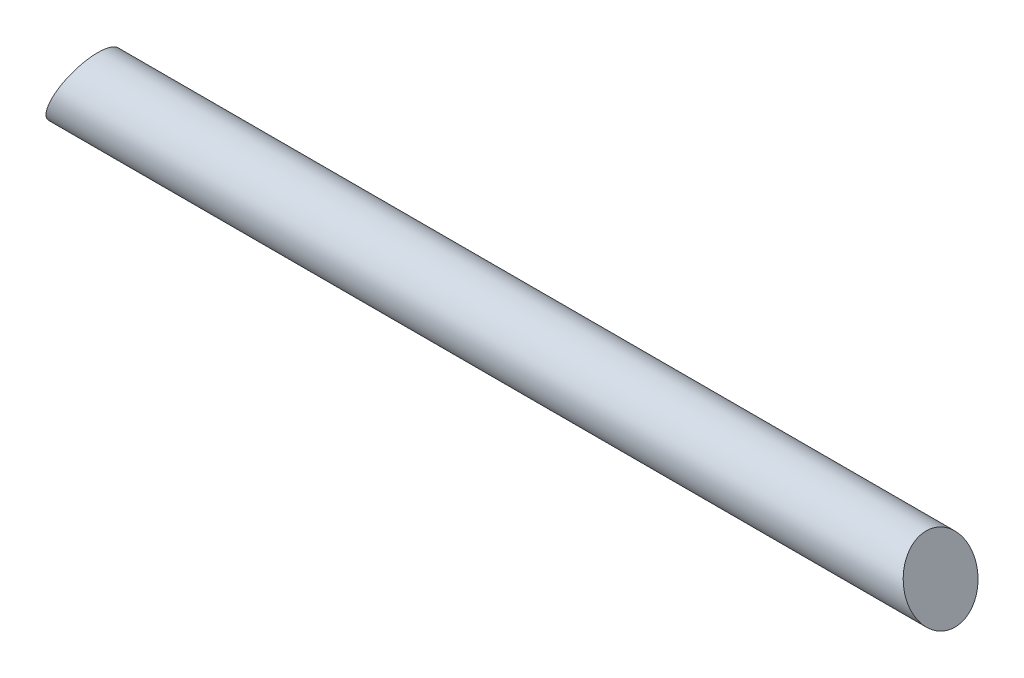
ISO-10303-21;
HEADER;
FILE_DESCRIPTION(('STEP AP214'),'2;1');
FILE_NAME('part.step','',(''),(''),'','','');
FILE_SCHEMA(('AUTOMOTIVE_DESIGN { 1 0 10303 214 1 1 1 1 }'));
ENDSEC;
DATA;
#1=APPLICATION_CONTEXT('core data for automotive mechanical design processes');
#2=APPLICATION_PROTOCOL_DEFINITION('international standard','automotive_design',2000,#1);
#3=PRODUCT_CONTEXT('',#1,'mechanical');
#4=PRODUCT('Part','Part','',(#3));
#5=PRODUCT_RELATED_PRODUCT_CATEGORY('part','',(#4));
#6=PRODUCT_DEFINITION_FORMATION('','',#4);
#7=PRODUCT_DEFINITION_CONTEXT('part definition',#1,'design');
#8=PRODUCT_DEFINITION('design','',#6,#7);
#9=PRODUCT_DEFINITION_SHAPE('','',#8);
#10=(LENGTH_UNIT() NAMED_UNIT(*) SI_UNIT(.MILLI.,.METRE.));
#11=(NAMED_UNIT(*) PLANE_ANGLE_UNIT() SI_UNIT($,.RADIAN.));
#12=(NAMED_UNIT(*) SI_UNIT($,.STERADIAN.) SOLID_ANGLE_UNIT());
#13=UNCERTAINTY_MEASURE_WITH_UNIT(LENGTH_MEASURE(1.E-05),#10,'distance_accuracy_value','');
#14=(GEOMETRIC_REPRESENTATION_CONTEXT(3) GLOBAL_UNCERTAINTY_ASSIGNED_CONTEXT((#13)) GLOBAL_UNIT_ASSIGNED_CONTEXT((#10,
#11,#12)) REPRESENTATION_CONTEXT('',''));
#15=CARTESIAN_POINT('',(0.,0.,0.));
#16=DIRECTION('',(0.,0.,1.));
#17=DIRECTION('',(1.,0.,0.));
#18=AXIS2_PLACEMENT_3D('',#15,#16,#17);
#19=CARTESIAN_POINT('',(-42.1546125218933,73.66,-1.397));
#20=DIRECTION('',(1.,0.,0.));
#21=DIRECTION('',(0.,0.,-1.));
#22=AXIS2_PLACEMENT_3D('',#19,#20,#21);
#23=CYLINDRICAL_SURFACE('',#22,2.98449999999999);
#24=CARTESIAN_POINT('',(-33.3614450700132,73.66,-1.397));
#25=DIRECTION('',(0.923076923076924,-0.384615384615383,0.));
#26=DIRECTION('',(0.384615384615383,0.923076923076924,0.));
#27=AXIS2_PLACEMENT_3D('',#24,#25,#26);
#28=ELLIPSE('',#27,3.23320833333332,2.98449999999999);
#29=CARTESIAN_POINT('',(-32.1179034033465,76.6445,-1.397));
#30=VERTEX_POINT('',#29);
#31=EDGE_CURVE('E10',#30,#30,#28,.T.);
#32=ORIENTED_EDGE('',*,*,#31,.T.);
#33=EDGE_LOOP('',(#32));
#34=FACE_BOUND('',#33,.T.);
#35=CARTESIAN_POINT('',(40.7218882633202,73.66,-1.397));
#36=DIRECTION('',(0.923076923076922,0.384615384615387,0.));
#37=DIRECTION('',(-0.384615384615387,0.923076923076922,0.));
#38=AXIS2_PLACEMENT_3D('',#35,#36,#37);
#39=ELLIPSE('',#38,3.23320833333333,2.98449999999999);
#40=CARTESIAN_POINT('',(39.4783465966536,76.6445,-1.397));
#41=VERTEX_POINT('',#40);
#42=EDGE_CURVE('E41',#41,#41,#39,.F.);
#43=ORIENTED_EDGE('',*,*,#42,.T.);
#44=EDGE_LOOP('',(#43));
#45=FACE_BOUND('',#44,.T.);
#46=ADVANCED_FACE('F35',(#34,#45),#23,.T.);
#47=CARTESIAN_POINT('',(-54.5777993495969,22.7407497289986,3.683));
#48=DIRECTION('',(0.923076923076924,-0.384615384615383,0.));
#49=DIRECTION('',(0.384615384615383,0.923076923076924,0.));
#50=AXIS2_PLACEMENT_3D('',#47,#48,#49);
#51=PLANE('',#50);
#52=ORIENTED_EDGE('',*,*,#31,.F.);
#53=EDGE_LOOP('',(#52));
#54=FACE_BOUND('',#53,.T.);
#55=ADVANCED_FACE('F50',(#54),#51,.F.);
#56=CARTESIAN_POINT('',(60.8494195853143,25.3539248272145,3.683));
#57=DIRECTION('',(0.923076923076922,0.384615384615387,0.));
#58=DIRECTION('',(-0.384615384615387,0.923076923076922,0.));
#59=AXIS2_PLACEMENT_3D('',#56,#57,#58);
#60=PLANE('',#59);
#61=ORIENTED_EDGE('',*,*,#42,.F.);
#62=EDGE_LOOP('',(#61));
#63=FACE_BOUND('',#62,.T.);
#64=ADVANCED_FACE('F48',(#63),#60,.T.);
#65=CLOSED_SHELL('',(#46,#55,#64));
#66=MANIFOLD_SOLID_BREP('B2',#65);
#67=ADVANCED_BREP_SHAPE_REPRESENTATION('',(#18,#66),#14);
#68=SHAPE_DEFINITION_REPRESENTATION(#9,#67);
ENDSEC;
END-ISO-10303-21;
